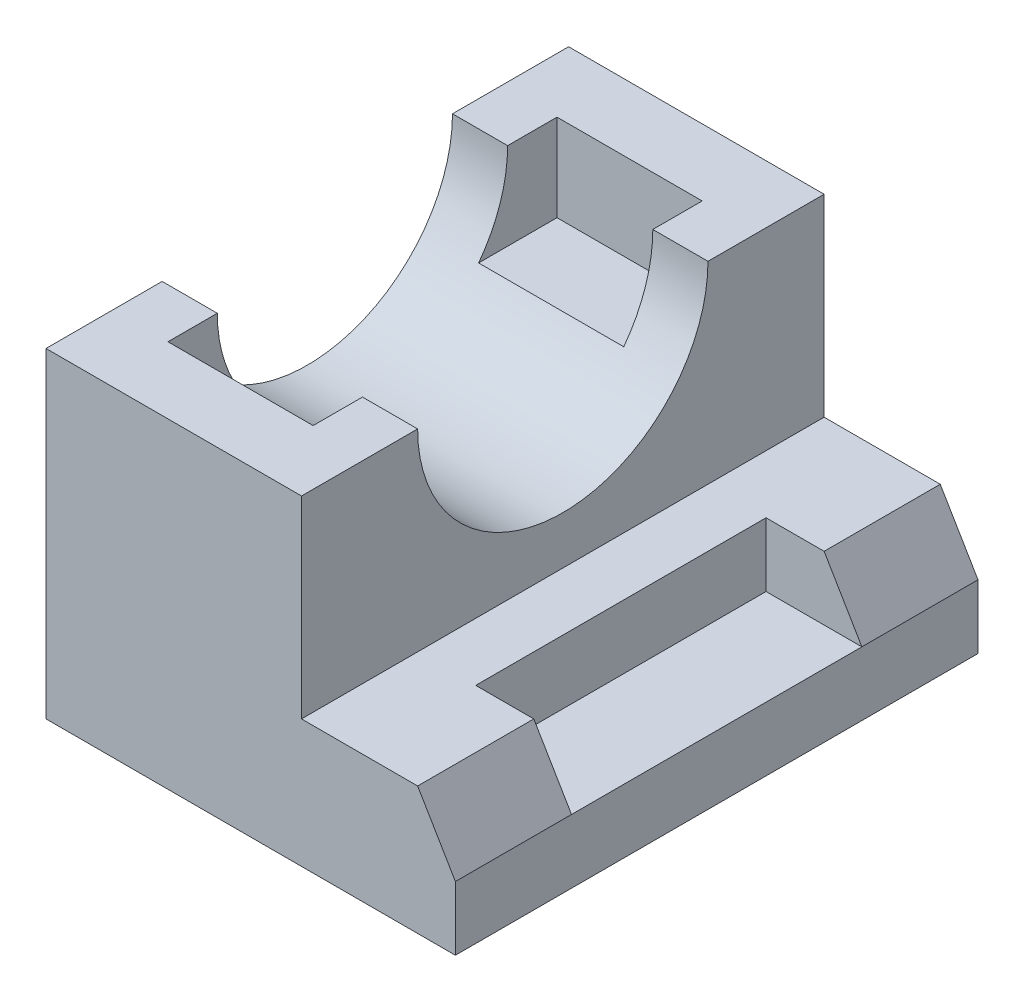
ISO-10303-21;
HEADER;
FILE_DESCRIPTION(('STEP AP214'),'2;1');
FILE_NAME('part.step','',(''),(''),'','','');
FILE_SCHEMA(('AUTOMOTIVE_DESIGN { 1 0 10303 214 1 1 1 1 }'));
ENDSEC;
DATA;
#1=APPLICATION_CONTEXT('core data for automotive mechanical design processes');
#2=APPLICATION_PROTOCOL_DEFINITION('international standard','automotive_design',2000,#1);
#3=PRODUCT_CONTEXT('',#1,'mechanical');
#4=PRODUCT('Part','Part','',(#3));
#5=PRODUCT_RELATED_PRODUCT_CATEGORY('part','',(#4));
#6=PRODUCT_DEFINITION_FORMATION('','',#4);
#7=PRODUCT_DEFINITION_CONTEXT('part definition',#1,'design');
#8=PRODUCT_DEFINITION('design','',#6,#7);
#9=PRODUCT_DEFINITION_SHAPE('','',#8);
#10=(LENGTH_UNIT() NAMED_UNIT(*) SI_UNIT(.MILLI.,.METRE.));
#11=(NAMED_UNIT(*) PLANE_ANGLE_UNIT() SI_UNIT($,.RADIAN.));
#12=(NAMED_UNIT(*) SI_UNIT($,.STERADIAN.) SOLID_ANGLE_UNIT());
#13=UNCERTAINTY_MEASURE_WITH_UNIT(LENGTH_MEASURE(1.E-05),#10,'distance_accuracy_value','');
#14=(GEOMETRIC_REPRESENTATION_CONTEXT(3) GLOBAL_UNCERTAINTY_ASSIGNED_CONTEXT((#13)) GLOBAL_UNIT_ASSIGNED_CONTEXT((#10,
#11,#12)) REPRESENTATION_CONTEXT('',''));
#15=CARTESIAN_POINT('',(0.,0.,0.));
#16=DIRECTION('',(0.,0.,1.));
#17=DIRECTION('',(1.,0.,0.));
#18=AXIS2_PLACEMENT_3D('',#15,#16,#17);
#19=CARTESIAN_POINT('',(-35.25,27.625,-90.));
#20=DIRECTION('',(0.,1.,0.));
#21=DIRECTION('',(0.,0.,1.));
#22=AXIS2_PLACEMENT_3D('',#19,#20,#21);
#23=PLANE('',#22);
#24=DIRECTION('',(1.,0.,0.));
#25=VECTOR('',#24,1.);
#26=CARTESIAN_POINT('',(-25.75,27.625,-11.5));
#27=LINE('',#26,#25);
#28=CARTESIAN_POINT('',(-25.75,27.625,-11.5));
#29=VERTEX_POINT('',#28);
#30=CARTESIAN_POINT('',(-0.750000000000004,27.625,-11.5));
#31=VERTEX_POINT('',#30);
#32=EDGE_CURVE('E227',#29,#31,#27,.T.);
#33=ORIENTED_EDGE('',*,*,#32,.F.);
#34=DIRECTION('',(0.,0.,-1.));
#35=VECTOR('',#34,1.);
#36=CARTESIAN_POINT('',(-25.75,27.625,-11.5));
#37=LINE('',#36,#35);
#38=CARTESIAN_POINT('',(-25.75,27.625,-20.));
#39=VERTEX_POINT('',#38);
#40=EDGE_CURVE('E235',#29,#39,#37,.T.);
#41=ORIENTED_EDGE('',*,*,#40,.T.);
#42=DIRECTION('',(1.,0.,0.));
#43=VECTOR('',#42,1.);
#44=CARTESIAN_POINT('',(-35.25,27.625,-20.));
#45=LINE('',#44,#43);
#46=CARTESIAN_POINT('',(-35.25,27.625,-20.));
#47=VERTEX_POINT('',#46);
#48=EDGE_CURVE('E256',#47,#39,#45,.T.);
#49=ORIENTED_EDGE('',*,*,#48,.F.);
#50=DIRECTION('',(0.,0.,1.));
#51=VECTOR('',#50,1.);
#52=CARTESIAN_POINT('',(-35.25,27.625,-90.));
#53=LINE('',#52,#51);
#54=CARTESIAN_POINT('',(-35.25,27.625,0.));
#55=VERTEX_POINT('',#54);
#56=EDGE_CURVE('E359',#47,#55,#53,.T.);
#57=ORIENTED_EDGE('',*,*,#56,.T.);
#58=DIRECTION('',(-1.,0.,0.));
#59=VECTOR('',#58,1.);
#60=CARTESIAN_POINT('',(-35.25,27.625,0.));
#61=LINE('',#60,#59);
#62=CARTESIAN_POINT('',(8.75,27.625,0.));
#63=VERTEX_POINT('',#62);
#64=EDGE_CURVE('E337',#63,#55,#61,.T.);
#65=ORIENTED_EDGE('',*,*,#64,.F.);
#66=DIRECTION('',(0.,0.,1.));
#67=VECTOR('',#66,1.);
#68=CARTESIAN_POINT('',(8.75,27.625,-90.));
#69=LINE('',#68,#67);
#70=CARTESIAN_POINT('',(8.74999999999999,27.625,-20.));
#71=VERTEX_POINT('',#70);
#72=EDGE_CURVE('E364',#71,#63,#69,.T.);
#73=ORIENTED_EDGE('',*,*,#72,.F.);
#74=CARTESIAN_POINT('',(-0.750000000000002,27.625,-20.));
#75=VERTEX_POINT('',#74);
#76=EDGE_CURVE('E255',#75,#71,#45,.T.);
#77=ORIENTED_EDGE('',*,*,#76,.F.);
#78=DIRECTION('',(0.,0.,-1.));
#79=VECTOR('',#78,1.);
#80=CARTESIAN_POINT('',(-0.750000000000004,27.625,-11.5));
#81=LINE('',#80,#79);
#82=EDGE_CURVE('E231',#31,#75,#81,.T.);
#83=ORIENTED_EDGE('',*,*,#82,.F.);
#84=EDGE_LOOP('',(#33,#41,#49,#57,#65,#73,#77,#83));
#85=FACE_BOUND('',#84,.T.);
#86=ADVANCED_FACE('F43',(#85),#23,.T.);
#87=DIRECTION('',(1.,0.,0.));
#88=VECTOR('',#87,1.);
#89=CARTESIAN_POINT('',(-25.75,27.625,-78.5));
#90=LINE('',#89,#88);
#91=CARTESIAN_POINT('',(-25.75,27.625,-78.5));
#92=VERTEX_POINT('',#91);
#93=CARTESIAN_POINT('',(-0.750000000000004,27.625,-78.5));
#94=VERTEX_POINT('',#93);
#95=EDGE_CURVE('E239',#92,#94,#90,.T.);
#96=ORIENTED_EDGE('',*,*,#95,.T.);
#97=DIRECTION('',(0.,0.,1.));
#98=VECTOR('',#97,1.);
#99=CARTESIAN_POINT('',(-0.750000000000004,27.625,-78.5));
#100=LINE('',#99,#98);
#101=CARTESIAN_POINT('',(-0.750000000000002,27.625,-70.));
#102=VERTEX_POINT('',#101);
#103=EDGE_CURVE('E209',#94,#102,#100,.T.);
#104=ORIENTED_EDGE('',*,*,#103,.T.);
#105=DIRECTION('',(1.,0.,0.));
#106=VECTOR('',#105,1.);
#107=CARTESIAN_POINT('',(-35.25,27.625,-70.));
#108=LINE('',#107,#106);
#109=CARTESIAN_POINT('',(8.75,27.625,-70.));
#110=VERTEX_POINT('',#109);
#111=EDGE_CURVE('E251',#110,#102,#108,.F.);
#112=ORIENTED_EDGE('',*,*,#111,.F.);
#113=CARTESIAN_POINT('',(8.75,27.625,-90.));
#114=VERTEX_POINT('',#113);
#115=EDGE_CURVE('E360',#114,#110,#69,.T.);
#116=ORIENTED_EDGE('',*,*,#115,.F.);
#117=DIRECTION('',(-1.,0.,0.));
#118=VECTOR('',#117,1.);
#119=CARTESIAN_POINT('',(-35.25,27.625,-90.));
#120=LINE('',#119,#118);
#121=CARTESIAN_POINT('',(-35.25,27.625,-90.));
#122=VERTEX_POINT('',#121);
#123=EDGE_CURVE('E309',#114,#122,#120,.T.);
#124=ORIENTED_EDGE('',*,*,#123,.T.);
#125=CARTESIAN_POINT('',(-35.25,27.625,-70.));
#126=VERTEX_POINT('',#125);
#127=EDGE_CURVE('E355',#122,#126,#53,.T.);
#128=ORIENTED_EDGE('',*,*,#127,.T.);
#129=CARTESIAN_POINT('',(-25.75,27.625,-70.));
#130=VERTEX_POINT('',#129);
#131=EDGE_CURVE('E249',#130,#126,#108,.F.);
#132=ORIENTED_EDGE('',*,*,#131,.F.);
#133=DIRECTION('',(0.,0.,1.));
#134=VECTOR('',#133,1.);
#135=CARTESIAN_POINT('',(-25.75,27.625,-78.5));
#136=LINE('',#135,#134);
#137=EDGE_CURVE('E205',#92,#130,#136,.T.);
#138=ORIENTED_EDGE('',*,*,#137,.F.);
#139=EDGE_LOOP('',(#96,#104,#112,#116,#124,#128,#132,#138));
#140=FACE_BOUND('',#139,.T.);
#141=ADVANCED_FACE('F404',(#140),#23,.T.);
#142=CARTESIAN_POINT('',(-35.25,27.625,-45.));
#143=DIRECTION('',(1.,0.,0.));
#144=DIRECTION('',(0.,1.,0.));
#145=AXIS2_PLACEMENT_3D('',#142,#143,#144);
#146=CYLINDRICAL_SURFACE('',#145,25.);
#147=CARTESIAN_POINT('',(-0.749999999999994,27.625,-45.));
#148=DIRECTION('',(-1.,0.,0.));
#149=DIRECTION('',(0.,0.,1.));
#150=AXIS2_PLACEMENT_3D('',#147,#148,#149);
#151=CIRCLE('',#150,25.);
#152=CARTESIAN_POINT('',(-0.750000000000001,12.625,-65.));
#153=VERTEX_POINT('',#152);
#154=EDGE_CURVE('E11',#153,#102,#151,.F.);
#155=ORIENTED_EDGE('',*,*,#154,.F.);
#156=DIRECTION('',(1.,0.,0.));
#157=VECTOR('',#156,1.);
#158=CARTESIAN_POINT('',(-35.25,12.625,-65.));
#159=LINE('',#158,#157);
#160=CARTESIAN_POINT('',(-25.75,12.625,-65.));
#161=VERTEX_POINT('',#160);
#162=EDGE_CURVE('E191',#153,#161,#159,.F.);
#163=ORIENTED_EDGE('',*,*,#162,.T.);
#164=CARTESIAN_POINT('',(-25.75,27.625,-45.));
#165=DIRECTION('',(-1.,0.,0.));
#166=DIRECTION('',(0.,0.,1.));
#167=AXIS2_PLACEMENT_3D('',#164,#165,#166);
#168=CIRCLE('',#167,25.);
#169=EDGE_CURVE('E52',#161,#130,#168,.F.);
#170=ORIENTED_EDGE('',*,*,#169,.T.);
#171=ORIENTED_EDGE('',*,*,#131,.T.);
#172=CARTESIAN_POINT('',(-35.25,27.625,-45.));
#173=DIRECTION('',(1.,0.,0.));
#174=DIRECTION('',(0.,1.,0.));
#175=AXIS2_PLACEMENT_3D('',#172,#173,#174);
#176=CIRCLE('',#175,25.);
#177=EDGE_CURVE('E215',#47,#126,#176,.T.);
#178=ORIENTED_EDGE('',*,*,#177,.F.);
#179=ORIENTED_EDGE('',*,*,#48,.T.);
#180=CARTESIAN_POINT('',(-25.75,27.625,-45.));
#181=DIRECTION('',(1.,0.,0.));
#182=DIRECTION('',(0.,0.,-1.));
#183=AXIS2_PLACEMENT_3D('',#180,#181,#182);
#184=CIRCLE('',#183,25.);
#185=CARTESIAN_POINT('',(-25.75,12.625,-25.));
#186=VERTEX_POINT('',#185);
#187=EDGE_CURVE('E392',#186,#39,#184,.F.);
#188=ORIENTED_EDGE('',*,*,#187,.F.);
#189=DIRECTION('',(1.,0.,0.));
#190=VECTOR('',#189,1.);
#191=CARTESIAN_POINT('',(-35.25,12.625,-25.));
#192=LINE('',#191,#190);
#193=CARTESIAN_POINT('',(-0.750000000000001,12.625,-25.));
#194=VERTEX_POINT('',#193);
#195=EDGE_CURVE('E384',#186,#194,#192,.T.);
#196=ORIENTED_EDGE('',*,*,#195,.T.);
#197=CARTESIAN_POINT('',(-0.749999999999994,27.625,-45.));
#198=DIRECTION('',(1.,0.,0.));
#199=DIRECTION('',(0.,0.,-1.));
#200=AXIS2_PLACEMENT_3D('',#197,#198,#199);
#201=CIRCLE('',#200,25.);
#202=EDGE_CURVE('E388',#194,#75,#201,.F.);
#203=ORIENTED_EDGE('',*,*,#202,.T.);
#204=ORIENTED_EDGE('',*,*,#76,.T.);
#205=CARTESIAN_POINT('',(8.75,27.625,-45.));
#206=DIRECTION('',(1.,0.,0.));
#207=DIRECTION('',(0.,1.,0.));
#208=AXIS2_PLACEMENT_3D('',#205,#206,#207);
#209=CIRCLE('',#208,25.);
#210=EDGE_CURVE('E211',#71,#110,#209,.T.);
#211=ORIENTED_EDGE('',*,*,#210,.T.);
#212=ORIENTED_EDGE('',*,*,#111,.T.);
#213=EDGE_LOOP('',(#155,#163,#170,#171,#178,#179,#188,#196,#203,#204,#211,#212));
#214=FACE_BOUND('',#213,.T.);
#215=ADVANCED_FACE('F400',(#214),#146,.F.);
#216=CARTESIAN_POINT('',(8.75,-5.625,-90.));
#217=DIRECTION('',(0.,1.,0.));
#218=DIRECTION('',(-1.,0.,0.));
#219=AXIS2_PLACEMENT_3D('',#216,#217,#218);
#220=PLANE('',#219);
#221=DIRECTION('',(0.,0.,1.));
#222=VECTOR('',#221,1.);
#223=CARTESIAN_POINT('',(18.75,-5.625,-70.));
#224=LINE('',#223,#222);
#225=CARTESIAN_POINT('',(18.75,-5.625,-70.));
#226=VERTEX_POINT('',#225);
#227=CARTESIAN_POINT('',(18.75,-5.625,-20.));
#228=VERTEX_POINT('',#227);
#229=EDGE_CURVE('E260',#226,#228,#224,.T.);
#230=ORIENTED_EDGE('',*,*,#229,.F.);
#231=DIRECTION('',(1.,0.,0.));
#232=VECTOR('',#231,1.);
#233=CARTESIAN_POINT('',(18.75,-5.625,-70.));
#234=LINE('',#233,#232);
#235=CARTESIAN_POINT('',(28.75,-5.625,-70.));
#236=VERTEX_POINT('',#235);
#237=EDGE_CURVE('E266',#226,#236,#234,.T.);
#238=ORIENTED_EDGE('',*,*,#237,.T.);
#239=DIRECTION('',(0.,0.,1.));
#240=VECTOR('',#239,1.);
#241=CARTESIAN_POINT('',(28.75,-5.625,-90.));
#242=LINE('',#241,#240);
#243=CARTESIAN_POINT('',(28.75,-5.625,-90.));
#244=VERTEX_POINT('',#243);
#245=EDGE_CURVE('E368',#244,#236,#242,.T.);
#246=ORIENTED_EDGE('',*,*,#245,.F.);
#247=DIRECTION('',(-1.,0.,0.));
#248=VECTOR('',#247,1.);
#249=CARTESIAN_POINT('',(8.75,-5.625,-90.));
#250=LINE('',#249,#248);
#251=CARTESIAN_POINT('',(8.75,-5.625,-90.));
#252=VERTEX_POINT('',#251);
#253=EDGE_CURVE('E301',#244,#252,#250,.T.);
#254=ORIENTED_EDGE('',*,*,#253,.T.);
#255=DIRECTION('',(0.,0.,1.));
#256=VECTOR('',#255,1.);
#257=CARTESIAN_POINT('',(8.75,-5.625,-90.));
#258=LINE('',#257,#256);
#259=CARTESIAN_POINT('',(8.75,-5.625,0.));
#260=VERTEX_POINT('',#259);
#261=EDGE_CURVE('E365',#252,#260,#258,.T.);
#262=ORIENTED_EDGE('',*,*,#261,.T.);
#263=DIRECTION('',(-1.,0.,0.));
#264=VECTOR('',#263,1.);
#265=CARTESIAN_POINT('',(8.75,-5.625,0.));
#266=LINE('',#265,#264);
#267=CARTESIAN_POINT('',(28.75,-5.625,0.));
#268=VERTEX_POINT('',#267);
#269=EDGE_CURVE('E329',#268,#260,#266,.T.);
#270=ORIENTED_EDGE('',*,*,#269,.F.);
#271=CARTESIAN_POINT('',(28.75,-5.625,-20.));
#272=VERTEX_POINT('',#271);
#273=EDGE_CURVE('E372',#272,#268,#242,.T.);
#274=ORIENTED_EDGE('',*,*,#273,.F.);
#275=DIRECTION('',(1.,0.,0.));
#276=VECTOR('',#275,1.);
#277=CARTESIAN_POINT('',(28.75,-5.625,-20.));
#278=LINE('',#277,#276);
#279=EDGE_CURVE('E280',#228,#272,#278,.T.);
#280=ORIENTED_EDGE('',*,*,#279,.F.);
#281=EDGE_LOOP('',(#230,#238,#246,#254,#262,#270,#274,#280));
#282=FACE_BOUND('',#281,.T.);
#283=ADVANCED_FACE('F450',(#282),#220,.T.);
#284=CARTESIAN_POINT('',(28.75,-5.625,-90.));
#285=DIRECTION('',(0.860926528214316,0.50872931212664,0.));
#286=DIRECTION('',(-0.50872931212664,0.860926528214316,0.));
#287=AXIS2_PLACEMENT_3D('',#284,#285,#286);
#288=PLANE('',#287);
#289=ORIENTED_EDGE('',*,*,#245,.T.);
#290=DIRECTION('',(0.50872931212664,-0.860926528214316,0.));
#291=VECTOR('',#290,1.);
#292=CARTESIAN_POINT('',(28.75,-5.625,-70.));
#293=LINE('',#292,#291);
#294=CARTESIAN_POINT('',(35.25,-16.625,-70.));
#295=VERTEX_POINT('',#294);
#296=EDGE_CURVE('E380',#236,#295,#293,.T.);
#297=ORIENTED_EDGE('',*,*,#296,.T.);
#298=DIRECTION('',(0.,0.,1.));
#299=VECTOR('',#298,1.);
#300=CARTESIAN_POINT('',(35.25,-16.625,-90.));
#301=LINE('',#300,#299);
#302=CARTESIAN_POINT('',(35.25,-16.625,-90.));
#303=VERTEX_POINT('',#302);
#304=EDGE_CURVE('E373',#303,#295,#301,.T.);
#305=ORIENTED_EDGE('',*,*,#304,.F.);
#306=DIRECTION('',(-0.50872931212664,0.860926528214316,0.));
#307=VECTOR('',#306,1.);
#308=CARTESIAN_POINT('',(28.75,-5.625,-90.));
#309=LINE('',#308,#307);
#310=EDGE_CURVE('E296',#303,#244,#309,.T.);
#311=ORIENTED_EDGE('',*,*,#310,.T.);
#312=EDGE_LOOP('',(#289,#297,#305,#311));
#313=FACE_BOUND('',#312,.T.);
#314=ADVANCED_FACE('F453',(#313),#288,.T.);
#315=CARTESIAN_POINT('',(35.25,-16.625,-90.));
#316=DIRECTION('',(1.,0.,0.));
#317=DIRECTION('',(0.,1.,0.));
#318=AXIS2_PLACEMENT_3D('',#315,#316,#317);
#319=PLANE('',#318);
#320=DIRECTION('',(0.,1.,0.));
#321=VECTOR('',#320,1.);
#322=CARTESIAN_POINT('',(35.25,-16.625,0.));
#323=LINE('',#322,#321);
#324=CARTESIAN_POINT('',(35.25,-27.625,0.));
#325=VERTEX_POINT('',#324);
#326=CARTESIAN_POINT('',(35.25,-16.625,0.));
#327=VERTEX_POINT('',#326);
#328=EDGE_CURVE('E289',#325,#327,#323,.T.);
#329=ORIENTED_EDGE('',*,*,#328,.F.);
#330=DIRECTION('',(0.,0.,1.));
#331=VECTOR('',#330,1.);
#332=CARTESIAN_POINT('',(35.25,-27.625,-90.));
#333=LINE('',#332,#331);
#334=CARTESIAN_POINT('',(35.25,-27.625,-90.));
#335=VERTEX_POINT('',#334);
#336=EDGE_CURVE('E348',#335,#325,#333,.T.);
#337=ORIENTED_EDGE('',*,*,#336,.F.);
#338=DIRECTION('',(0.,1.,0.));
#339=VECTOR('',#338,1.);
#340=CARTESIAN_POINT('',(35.25,-16.625,-90.));
#341=LINE('',#340,#339);
#342=EDGE_CURVE('E292',#335,#303,#341,.T.);
#343=ORIENTED_EDGE('',*,*,#342,.T.);
#344=ORIENTED_EDGE('',*,*,#304,.T.);
#345=DIRECTION('',(0.,0.,1.));
#346=VECTOR('',#345,1.);
#347=CARTESIAN_POINT('',(35.25,-16.625,-70.));
#348=LINE('',#347,#346);
#349=CARTESIAN_POINT('',(35.25,-16.625,-20.));
#350=VERTEX_POINT('',#349);
#351=EDGE_CURVE('E269',#295,#350,#348,.T.);
#352=ORIENTED_EDGE('',*,*,#351,.T.);
#353=EDGE_CURVE('E321',#350,#327,#301,.T.);
#354=ORIENTED_EDGE('',*,*,#353,.T.);
#355=EDGE_LOOP('',(#329,#337,#343,#344,#352,#354));
#356=FACE_BOUND('',#355,.T.);
#357=ADVANCED_FACE('F45',(#356),#319,.T.);
#358=CARTESIAN_POINT('',(-35.25,-27.625,-90.));
#359=DIRECTION('',(0.,-1.,0.));
#360=DIRECTION('',(0.,0.,-1.));
#361=AXIS2_PLACEMENT_3D('',#358,#359,#360);
#362=PLANE('',#361);
#363=DIRECTION('',(1.,0.,0.));
#364=VECTOR('',#363,1.);
#365=CARTESIAN_POINT('',(-35.25,-27.625,0.));
#366=LINE('',#365,#364);
#367=CARTESIAN_POINT('',(-35.25,-27.625,0.));
#368=VERTEX_POINT('',#367);
#369=EDGE_CURVE('E297',#368,#325,#366,.T.);
#370=ORIENTED_EDGE('',*,*,#369,.F.);
#371=DIRECTION('',(0.,0.,1.));
#372=VECTOR('',#371,1.);
#373=CARTESIAN_POINT('',(-35.25,-27.625,-90.));
#374=LINE('',#373,#372);
#375=CARTESIAN_POINT('',(-35.25,-27.625,-90.));
#376=VERTEX_POINT('',#375);
#377=EDGE_CURVE('E352',#376,#368,#374,.T.);
#378=ORIENTED_EDGE('',*,*,#377,.F.);
#379=DIRECTION('',(1.,0.,0.));
#380=VECTOR('',#379,1.);
#381=CARTESIAN_POINT('',(-35.25,-27.625,-90.));
#382=LINE('',#381,#380);
#383=EDGE_CURVE('E317',#376,#335,#382,.T.);
#384=ORIENTED_EDGE('',*,*,#383,.T.);
#385=ORIENTED_EDGE('',*,*,#336,.T.);
#386=EDGE_LOOP('',(#370,#378,#384,#385));
#387=FACE_BOUND('',#386,.T.);
#388=ADVANCED_FACE('F457',(#387),#362,.T.);
#389=CARTESIAN_POINT('',(-35.25,27.625,-90.));
#390=DIRECTION('',(-1.,0.,0.));
#391=DIRECTION('',(0.,0.,1.));
#392=AXIS2_PLACEMENT_3D('',#389,#390,#391);
#393=PLANE('',#392);
#394=ORIENTED_EDGE('',*,*,#177,.T.);
#395=ORIENTED_EDGE('',*,*,#127,.F.);
#396=DIRECTION('',(0.,-1.,0.));
#397=VECTOR('',#396,1.);
#398=CARTESIAN_POINT('',(-35.25,27.625,-90.));
#399=LINE('',#398,#397);
#400=EDGE_CURVE('E313',#122,#376,#399,.T.);
#401=ORIENTED_EDGE('',*,*,#400,.T.);
#402=ORIENTED_EDGE('',*,*,#377,.T.);
#403=DIRECTION('',(0.,-1.,0.));
#404=VECTOR('',#403,1.);
#405=CARTESIAN_POINT('',(-35.25,27.625,0.));
#406=LINE('',#405,#404);
#407=EDGE_CURVE('E341',#55,#368,#406,.T.);
#408=ORIENTED_EDGE('',*,*,#407,.F.);
#409=ORIENTED_EDGE('',*,*,#56,.F.);
#410=EDGE_LOOP('',(#394,#395,#401,#402,#408,#409));
#411=FACE_BOUND('',#410,.T.);
#412=ADVANCED_FACE('F419',(#411),#393,.T.);
#413=CARTESIAN_POINT('',(8.75,27.625,-90.));
#414=DIRECTION('',(1.,0.,0.));
#415=DIRECTION('',(0.,1.,0.));
#416=AXIS2_PLACEMENT_3D('',#413,#414,#415);
#417=PLANE('',#416);
#418=ORIENTED_EDGE('',*,*,#210,.F.);
#419=ORIENTED_EDGE('',*,*,#72,.T.);
#420=DIRECTION('',(0.,1.,0.));
#421=VECTOR('',#420,1.);
#422=CARTESIAN_POINT('',(8.75,27.625,0.));
#423=LINE('',#422,#421);
#424=EDGE_CURVE('E333',#260,#63,#423,.T.);
#425=ORIENTED_EDGE('',*,*,#424,.F.);
#426=ORIENTED_EDGE('',*,*,#261,.F.);
#427=DIRECTION('',(0.,1.,0.));
#428=VECTOR('',#427,1.);
#429=CARTESIAN_POINT('',(8.75,27.625,-90.));
#430=LINE('',#429,#428);
#431=EDGE_CURVE('E305',#252,#114,#430,.T.);
#432=ORIENTED_EDGE('',*,*,#431,.T.);
#433=ORIENTED_EDGE('',*,*,#115,.T.);
#434=EDGE_LOOP('',(#418,#419,#425,#426,#432,#433));
#435=FACE_BOUND('',#434,.T.);
#436=ADVANCED_FACE('F427',(#435),#417,.T.);
#437=DIRECTION('',(0.50872931212664,-0.860926528214316,0.));
#438=VECTOR('',#437,1.);
#439=CARTESIAN_POINT('',(28.75,-5.62500000000006,-20.));
#440=LINE('',#439,#438);
#441=EDGE_CURVE('E351',#272,#350,#440,.T.);
#442=ORIENTED_EDGE('',*,*,#441,.F.);
#443=ORIENTED_EDGE('',*,*,#273,.T.);
#444=DIRECTION('',(-0.50872931212664,0.860926528214316,0.));
#445=VECTOR('',#444,1.);
#446=CARTESIAN_POINT('',(28.75,-5.625,0.));
#447=LINE('',#446,#445);
#448=EDGE_CURVE('E325',#327,#268,#447,.T.);
#449=ORIENTED_EDGE('',*,*,#448,.F.);
#450=ORIENTED_EDGE('',*,*,#353,.F.);
#451=EDGE_LOOP('',(#442,#443,#449,#450));
#452=FACE_BOUND('',#451,.T.);
#453=ADVANCED_FACE('F462',(#452),#288,.T.);
#454=CARTESIAN_POINT('',(0.,0.,-90.));
#455=DIRECTION('',(0.,0.,1.));
#456=DIRECTION('',(1.,0.,0.));
#457=AXIS2_PLACEMENT_3D('',#454,#455,#456);
#458=PLANE('',#457);
#459=ORIENTED_EDGE('',*,*,#342,.F.);
#460=ORIENTED_EDGE('',*,*,#383,.F.);
#461=ORIENTED_EDGE('',*,*,#400,.F.);
#462=ORIENTED_EDGE('',*,*,#123,.F.);
#463=ORIENTED_EDGE('',*,*,#431,.F.);
#464=ORIENTED_EDGE('',*,*,#253,.F.);
#465=ORIENTED_EDGE('',*,*,#310,.F.);
#466=EDGE_LOOP('',(#459,#460,#461,#462,#463,#464,#465));
#467=FACE_BOUND('',#466,.T.);
#468=ADVANCED_FACE('F445',(#467),#458,.F.);
#469=CARTESIAN_POINT('',(0.,0.,0.));
#470=DIRECTION('',(0.,0.,1.));
#471=DIRECTION('',(1.,0.,0.));
#472=AXIS2_PLACEMENT_3D('',#469,#470,#471);
#473=PLANE('',#472);
#474=ORIENTED_EDGE('',*,*,#328,.T.);
#475=ORIENTED_EDGE('',*,*,#448,.T.);
#476=ORIENTED_EDGE('',*,*,#269,.T.);
#477=ORIENTED_EDGE('',*,*,#424,.T.);
#478=ORIENTED_EDGE('',*,*,#64,.T.);
#479=ORIENTED_EDGE('',*,*,#407,.T.);
#480=ORIENTED_EDGE('',*,*,#369,.T.);
#481=EDGE_LOOP('',(#474,#475,#476,#477,#478,#479,#480));
#482=FACE_BOUND('',#481,.T.);
#483=ADVANCED_FACE('F422',(#482),#473,.T.);
#484=CARTESIAN_POINT('',(18.75,-16.625,-70.));
#485=DIRECTION('',(-1.,0.,0.));
#486=DIRECTION('',(0.,0.,1.));
#487=AXIS2_PLACEMENT_3D('',#484,#485,#486);
#488=PLANE('',#487);
#489=ORIENTED_EDGE('',*,*,#229,.T.);
#490=DIRECTION('',(0.,1.,0.));
#491=VECTOR('',#490,1.);
#492=CARTESIAN_POINT('',(18.75,-16.625,-20.));
#493=LINE('',#492,#491);
#494=CARTESIAN_POINT('',(18.75,-16.625,-20.));
#495=VERTEX_POINT('',#494);
#496=EDGE_CURVE('E276',#495,#228,#493,.T.);
#497=ORIENTED_EDGE('',*,*,#496,.F.);
#498=DIRECTION('',(0.,0.,1.));
#499=VECTOR('',#498,1.);
#500=CARTESIAN_POINT('',(18.75,-16.625,-70.));
#501=LINE('',#500,#499);
#502=CARTESIAN_POINT('',(18.75,-16.625,-70.));
#503=VERTEX_POINT('',#502);
#504=EDGE_CURVE('E261',#503,#495,#501,.T.);
#505=ORIENTED_EDGE('',*,*,#504,.F.);
#506=DIRECTION('',(0.,1.,0.));
#507=VECTOR('',#506,1.);
#508=CARTESIAN_POINT('',(18.75,-16.625,-70.));
#509=LINE('',#508,#507);
#510=EDGE_CURVE('E286',#503,#226,#509,.T.);
#511=ORIENTED_EDGE('',*,*,#510,.T.);
#512=EDGE_LOOP('',(#489,#497,#505,#511));
#513=FACE_BOUND('',#512,.T.);
#514=ADVANCED_FACE('F470',(#513),#488,.F.);
#515=CARTESIAN_POINT('',(18.75,-16.625,-70.));
#516=DIRECTION('',(0.,0.,1.));
#517=DIRECTION('',(1.,0.,0.));
#518=AXIS2_PLACEMENT_3D('',#515,#516,#517);
#519=PLANE('',#518);
#520=ORIENTED_EDGE('',*,*,#237,.F.);
#521=ORIENTED_EDGE('',*,*,#510,.F.);
#522=DIRECTION('',(1.,0.,0.));
#523=VECTOR('',#522,1.);
#524=CARTESIAN_POINT('',(28.75,-16.625,-70.));
#525=LINE('',#524,#523);
#526=EDGE_CURVE('E273',#503,#295,#525,.T.);
#527=ORIENTED_EDGE('',*,*,#526,.T.);
#528=ORIENTED_EDGE('',*,*,#296,.F.);
#529=EDGE_LOOP('',(#520,#521,#527,#528));
#530=FACE_BOUND('',#529,.T.);
#531=ADVANCED_FACE('F473',(#530),#519,.T.);
#532=CARTESIAN_POINT('',(28.75,-16.625,-20.));
#533=DIRECTION('',(0.,0.,1.));
#534=DIRECTION('',(1.,0.,0.));
#535=AXIS2_PLACEMENT_3D('',#532,#533,#534);
#536=PLANE('',#535);
#537=ORIENTED_EDGE('',*,*,#441,.T.);
#538=DIRECTION('',(1.,0.,0.));
#539=VECTOR('',#538,1.);
#540=CARTESIAN_POINT('',(18.75,-16.625,-20.));
#541=LINE('',#540,#539);
#542=EDGE_CURVE('E265',#495,#350,#541,.T.);
#543=ORIENTED_EDGE('',*,*,#542,.F.);
#544=ORIENTED_EDGE('',*,*,#496,.T.);
#545=ORIENTED_EDGE('',*,*,#279,.T.);
#546=EDGE_LOOP('',(#537,#543,#544,#545));
#547=FACE_BOUND('',#546,.T.);
#548=ADVANCED_FACE('F466',(#547),#536,.F.);
#549=CARTESIAN_POINT('',(0.,-16.625,0.));
#550=DIRECTION('',(0.,1.,0.));
#551=DIRECTION('',(-1.,0.,0.));
#552=AXIS2_PLACEMENT_3D('',#549,#550,#551);
#553=PLANE('',#552);
#554=ORIENTED_EDGE('',*,*,#504,.T.);
#555=ORIENTED_EDGE('',*,*,#542,.T.);
#556=ORIENTED_EDGE('',*,*,#351,.F.);
#557=ORIENTED_EDGE('',*,*,#526,.F.);
#558=EDGE_LOOP('',(#554,#555,#556,#557));
#559=FACE_BOUND('',#558,.T.);
#560=ADVANCED_FACE('F476',(#559),#553,.T.);
#561=CARTESIAN_POINT('',(-25.75,12.625,-11.5));
#562=DIRECTION('',(1.,0.,0.));
#563=DIRECTION('',(0.,0.,-1.));
#564=AXIS2_PLACEMENT_3D('',#561,#562,#563);
#565=PLANE('',#564);
#566=ORIENTED_EDGE('',*,*,#187,.T.);
#567=ORIENTED_EDGE('',*,*,#40,.F.);
#568=DIRECTION('',(0.,1.,0.));
#569=VECTOR('',#568,1.);
#570=CARTESIAN_POINT('',(-25.75,12.625,-11.5));
#571=LINE('',#570,#569);
#572=CARTESIAN_POINT('',(-25.75,12.625,-11.5));
#573=VERTEX_POINT('',#572);
#574=EDGE_CURVE('E223',#573,#29,#571,.T.);
#575=ORIENTED_EDGE('',*,*,#574,.F.);
#576=DIRECTION('',(0.,0.,-1.));
#577=VECTOR('',#576,1.);
#578=CARTESIAN_POINT('',(-25.75,12.625,-11.5));
#579=LINE('',#578,#577);
#580=EDGE_CURVE('E232',#573,#186,#579,.T.);
#581=ORIENTED_EDGE('',*,*,#580,.T.);
#582=EDGE_LOOP('',(#566,#567,#575,#581));
#583=FACE_BOUND('',#582,.T.);
#584=ADVANCED_FACE('F478',(#583),#565,.T.);
#585=CARTESIAN_POINT('',(-0.750000000000004,12.625,-11.5));
#586=DIRECTION('',(1.,0.,0.));
#587=DIRECTION('',(0.,0.,-1.));
#588=AXIS2_PLACEMENT_3D('',#585,#586,#587);
#589=PLANE('',#588);
#590=DIRECTION('',(0.,0.,-1.));
#591=VECTOR('',#590,1.);
#592=CARTESIAN_POINT('',(-0.750000000000004,12.625,-11.5));
#593=LINE('',#592,#591);
#594=CARTESIAN_POINT('',(-0.750000000000004,12.625,-11.5));
#595=VERTEX_POINT('',#594);
#596=EDGE_CURVE('E67',#595,#194,#593,.T.);
#597=ORIENTED_EDGE('',*,*,#596,.F.);
#598=DIRECTION('',(0.,1.,0.));
#599=VECTOR('',#598,1.);
#600=CARTESIAN_POINT('',(-0.750000000000004,12.625,-11.5));
#601=LINE('',#600,#599);
#602=EDGE_CURVE('E220',#595,#31,#601,.T.);
#603=ORIENTED_EDGE('',*,*,#602,.T.);
#604=ORIENTED_EDGE('',*,*,#82,.T.);
#605=ORIENTED_EDGE('',*,*,#202,.F.);
#606=EDGE_LOOP('',(#597,#603,#604,#605));
#607=FACE_BOUND('',#606,.T.);
#608=ADVANCED_FACE('F434',(#607),#589,.F.);
#609=CARTESIAN_POINT('',(0.,12.625,0.));
#610=DIRECTION('',(0.,-1.,0.));
#611=DIRECTION('',(0.,0.,-1.));
#612=AXIS2_PLACEMENT_3D('',#609,#610,#611);
#613=PLANE('',#612);
#614=ORIENTED_EDGE('',*,*,#580,.F.);
#615=DIRECTION('',(1.,0.,0.));
#616=VECTOR('',#615,1.);
#617=CARTESIAN_POINT('',(-25.75,12.625,-11.5));
#618=LINE('',#617,#616);
#619=EDGE_CURVE('E226',#573,#595,#618,.T.);
#620=ORIENTED_EDGE('',*,*,#619,.T.);
#621=ORIENTED_EDGE('',*,*,#596,.T.);
#622=ORIENTED_EDGE('',*,*,#195,.F.);
#623=EDGE_LOOP('',(#614,#620,#621,#622));
#624=FACE_BOUND('',#623,.T.);
#625=ADVANCED_FACE('F584',(#624),#613,.F.);
#626=CARTESIAN_POINT('',(-25.75,12.625,-11.5));
#627=DIRECTION('',(0.,0.,1.));
#628=DIRECTION('',(1.,0.,0.));
#629=AXIS2_PLACEMENT_3D('',#626,#627,#628);
#630=PLANE('',#629);
#631=ORIENTED_EDGE('',*,*,#32,.T.);
#632=ORIENTED_EDGE('',*,*,#602,.F.);
#633=ORIENTED_EDGE('',*,*,#619,.F.);
#634=ORIENTED_EDGE('',*,*,#574,.T.);
#635=EDGE_LOOP('',(#631,#632,#633,#634));
#636=FACE_BOUND('',#635,.T.);
#637=ADVANCED_FACE('F437',(#636),#630,.F.);
#638=CARTESIAN_POINT('',(-0.750000000000004,12.625,-78.5));
#639=DIRECTION('',(-1.,0.,0.));
#640=DIRECTION('',(0.,0.,1.));
#641=AXIS2_PLACEMENT_3D('',#638,#639,#640);
#642=PLANE('',#641);
#643=ORIENTED_EDGE('',*,*,#154,.T.);
#644=ORIENTED_EDGE('',*,*,#103,.F.);
#645=DIRECTION('',(0.,1.,0.));
#646=VECTOR('',#645,1.);
#647=CARTESIAN_POINT('',(-0.750000000000004,12.625,-78.5));
#648=LINE('',#647,#646);
#649=CARTESIAN_POINT('',(-0.750000000000004,12.625,-78.5));
#650=VERTEX_POINT('',#649);
#651=EDGE_CURVE('E201',#650,#94,#648,.T.);
#652=ORIENTED_EDGE('',*,*,#651,.F.);
#653=DIRECTION('',(0.,0.,1.));
#654=VECTOR('',#653,1.);
#655=CARTESIAN_POINT('',(-0.750000000000004,12.625,-78.5));
#656=LINE('',#655,#654);
#657=EDGE_CURVE('E186',#650,#153,#656,.T.);
#658=ORIENTED_EDGE('',*,*,#657,.T.);
#659=EDGE_LOOP('',(#643,#644,#652,#658));
#660=FACE_BOUND('',#659,.T.);
#661=ADVANCED_FACE('F207',(#660),#642,.T.);
#662=CARTESIAN_POINT('',(-25.75,12.625,-78.5));
#663=DIRECTION('',(-1.,0.,0.));
#664=DIRECTION('',(0.,0.,1.));
#665=AXIS2_PLACEMENT_3D('',#662,#663,#664);
#666=PLANE('',#665);
#667=DIRECTION('',(0.,0.,1.));
#668=VECTOR('',#667,1.);
#669=CARTESIAN_POINT('',(-25.75,12.625,-78.5));
#670=LINE('',#669,#668);
#671=CARTESIAN_POINT('',(-25.75,12.625,-78.5));
#672=VERTEX_POINT('',#671);
#673=EDGE_CURVE('E59',#672,#161,#670,.T.);
#674=ORIENTED_EDGE('',*,*,#673,.F.);
#675=DIRECTION('',(0.,1.,0.));
#676=VECTOR('',#675,1.);
#677=CARTESIAN_POINT('',(-25.75,12.625,-78.5));
#678=LINE('',#677,#676);
#679=EDGE_CURVE('E203',#672,#92,#678,.T.);
#680=ORIENTED_EDGE('',*,*,#679,.T.);
#681=ORIENTED_EDGE('',*,*,#137,.T.);
#682=ORIENTED_EDGE('',*,*,#169,.F.);
#683=EDGE_LOOP('',(#674,#680,#681,#682));
#684=FACE_BOUND('',#683,.T.);
#685=ADVANCED_FACE('F612',(#684),#666,.F.);
#686=CARTESIAN_POINT('',(0.,12.625,0.));
#687=DIRECTION('',(0.,-1.,0.));
#688=DIRECTION('',(0.,0.,-1.));
#689=AXIS2_PLACEMENT_3D('',#686,#687,#688);
#690=PLANE('',#689);
#691=ORIENTED_EDGE('',*,*,#657,.F.);
#692=DIRECTION('',(1.,0.,0.));
#693=VECTOR('',#692,1.);
#694=CARTESIAN_POINT('',(-25.75,12.625,-78.5));
#695=LINE('',#694,#693);
#696=EDGE_CURVE('E189',#672,#650,#695,.T.);
#697=ORIENTED_EDGE('',*,*,#696,.F.);
#698=ORIENTED_EDGE('',*,*,#673,.T.);
#699=ORIENTED_EDGE('',*,*,#162,.F.);
#700=EDGE_LOOP('',(#691,#697,#698,#699));
#701=FACE_BOUND('',#700,.T.);
#702=ADVANCED_FACE('F188',(#701),#690,.F.);
#703=CARTESIAN_POINT('',(-25.75,12.625,-78.5));
#704=DIRECTION('',(0.,0.,1.));
#705=DIRECTION('',(1.,0.,0.));
#706=AXIS2_PLACEMENT_3D('',#703,#704,#705);
#707=PLANE('',#706);
#708=ORIENTED_EDGE('',*,*,#95,.F.);
#709=ORIENTED_EDGE('',*,*,#679,.F.);
#710=ORIENTED_EDGE('',*,*,#696,.T.);
#711=ORIENTED_EDGE('',*,*,#651,.T.);
#712=EDGE_LOOP('',(#708,#709,#710,#711));
#713=FACE_BOUND('',#712,.T.);
#714=ADVANCED_FACE('F200',(#713),#707,.T.);
#715=CLOSED_SHELL('',(#86,#141,#215,#283,#314,#357,#388,#412,#436,#453,#468,#483,#514,#531,#548,
#560,#584,#608,#625,#637,#661,#685,#702,#714));
#716=MANIFOLD_SOLID_BREP('B2',#715);
#717=ADVANCED_BREP_SHAPE_REPRESENTATION('',(#18,#716),#14);
#718=SHAPE_DEFINITION_REPRESENTATION(#9,#717);
ENDSEC;
END-ISO-10303-21;
